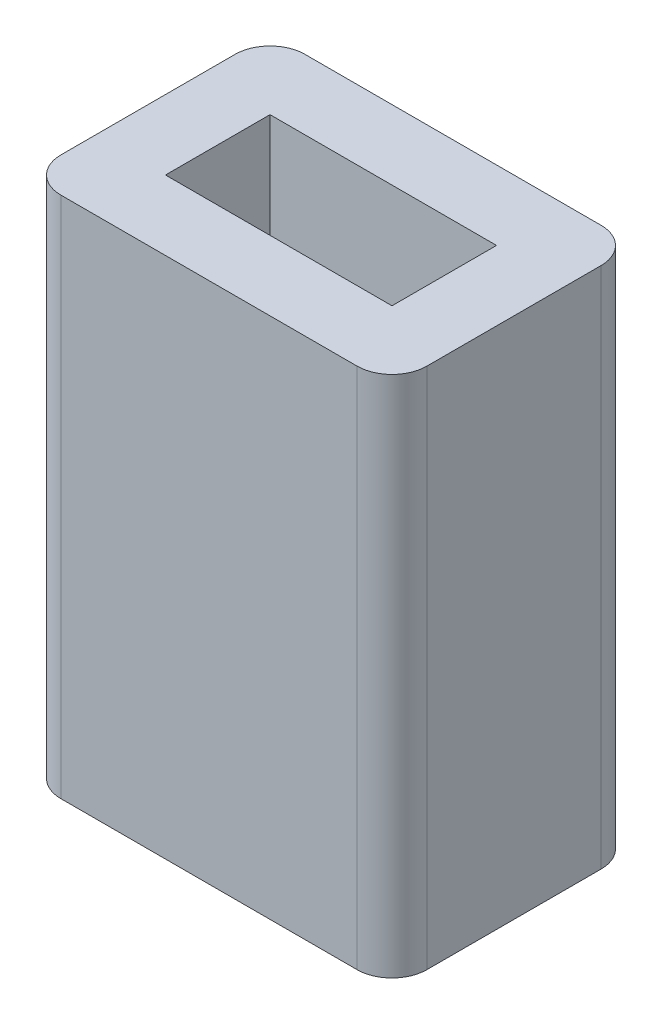
ISO-10303-21;
HEADER;
FILE_DESCRIPTION(('STEP AP214'),'2;1');
FILE_NAME('part.step','',(''),(''),'','','');
FILE_SCHEMA(('AUTOMOTIVE_DESIGN { 1 0 10303 214 1 1 1 1 }'));
ENDSEC;
DATA;
#1=APPLICATION_CONTEXT('core data for automotive mechanical design processes');
#2=APPLICATION_PROTOCOL_DEFINITION('international standard','automotive_design',2000,#1);
#3=PRODUCT_CONTEXT('',#1,'mechanical');
#4=PRODUCT('Part','Part','',(#3));
#5=PRODUCT_RELATED_PRODUCT_CATEGORY('part','',(#4));
#6=PRODUCT_DEFINITION_FORMATION('','',#4);
#7=PRODUCT_DEFINITION_CONTEXT('part definition',#1,'design');
#8=PRODUCT_DEFINITION('design','',#6,#7);
#9=PRODUCT_DEFINITION_SHAPE('','',#8);
#10=(LENGTH_UNIT() NAMED_UNIT(*) SI_UNIT(.MILLI.,.METRE.));
#11=(NAMED_UNIT(*) PLANE_ANGLE_UNIT() SI_UNIT($,.RADIAN.));
#12=(NAMED_UNIT(*) SI_UNIT($,.STERADIAN.) SOLID_ANGLE_UNIT());
#13=UNCERTAINTY_MEASURE_WITH_UNIT(LENGTH_MEASURE(1.E-05),#10,'distance_accuracy_value','');
#14=(GEOMETRIC_REPRESENTATION_CONTEXT(3) GLOBAL_UNCERTAINTY_ASSIGNED_CONTEXT((#13)) GLOBAL_UNIT_ASSIGNED_CONTEXT((#10,
#11,#12)) REPRESENTATION_CONTEXT('',''));
#15=CARTESIAN_POINT('',(0.,0.,0.));
#16=DIRECTION('',(0.,0.,1.));
#17=DIRECTION('',(1.,0.,0.));
#18=AXIS2_PLACEMENT_3D('',#15,#16,#17);
#19=CARTESIAN_POINT('',(0.,15.,0.));
#20=DIRECTION('',(0.,1.,0.));
#21=DIRECTION('',(0.,0.,1.));
#22=AXIS2_PLACEMENT_3D('',#19,#20,#21);
#23=PLANE('',#22);
#24=DIRECTION('',(-1.,0.,0.));
#25=VECTOR('',#24,1.);
#26=CARTESIAN_POINT('',(-5.25,15.,-3.5));
#27=LINE('',#26,#25);
#28=CARTESIAN_POINT('',(4.25,15.,-3.5));
#29=VERTEX_POINT('',#28);
#30=CARTESIAN_POINT('',(-4.25,15.,-3.5));
#31=VERTEX_POINT('',#30);
#32=EDGE_CURVE('E195',#29,#31,#27,.T.);
#33=ORIENTED_EDGE('',*,*,#32,.T.);
#34=CARTESIAN_POINT('',(-4.25,15.,-2.5));
#35=DIRECTION('',(0.,1.,0.));
#36=DIRECTION('',(0.,0.,1.));
#37=AXIS2_PLACEMENT_3D('',#34,#35,#36);
#38=CIRCLE('',#37,1.);
#39=CARTESIAN_POINT('',(-5.25,15.,-2.5));
#40=VERTEX_POINT('',#39);
#41=EDGE_CURVE('E250',#31,#40,#38,.T.);
#42=ORIENTED_EDGE('',*,*,#41,.T.);
#43=DIRECTION('',(0.,0.,1.));
#44=VECTOR('',#43,1.);
#45=CARTESIAN_POINT('',(-5.25,15.,3.5));
#46=LINE('',#45,#44);
#47=CARTESIAN_POINT('',(-5.25,15.,2.5));
#48=VERTEX_POINT('',#47);
#49=EDGE_CURVE('E199',#40,#48,#46,.T.);
#50=ORIENTED_EDGE('',*,*,#49,.T.);
#51=CARTESIAN_POINT('',(-4.25,15.,2.5));
#52=DIRECTION('',(0.,1.,0.));
#53=DIRECTION('',(0.,0.,1.));
#54=AXIS2_PLACEMENT_3D('',#51,#52,#53);
#55=CIRCLE('',#54,1.);
#56=CARTESIAN_POINT('',(-4.25,15.,3.5));
#57=VERTEX_POINT('',#56);
#58=EDGE_CURVE('E242',#48,#57,#55,.T.);
#59=ORIENTED_EDGE('',*,*,#58,.T.);
#60=DIRECTION('',(1.,0.,0.));
#61=VECTOR('',#60,1.);
#62=CARTESIAN_POINT('',(-5.25,15.,3.5));
#63=LINE('',#62,#61);
#64=CARTESIAN_POINT('',(4.25,15.,3.5));
#65=VERTEX_POINT('',#64);
#66=EDGE_CURVE('E188',#57,#65,#63,.T.);
#67=ORIENTED_EDGE('',*,*,#66,.T.);
#68=CARTESIAN_POINT('',(4.25,15.,2.5));
#69=DIRECTION('',(0.,1.,0.));
#70=DIRECTION('',(0.,0.,1.));
#71=AXIS2_PLACEMENT_3D('',#68,#69,#70);
#72=CIRCLE('',#71,1.);
#73=CARTESIAN_POINT('',(5.25,15.,2.5));
#74=VERTEX_POINT('',#73);
#75=EDGE_CURVE('E66',#65,#74,#72,.T.);
#76=ORIENTED_EDGE('',*,*,#75,.T.);
#77=DIRECTION('',(0.,0.,-1.));
#78=VECTOR('',#77,1.);
#79=CARTESIAN_POINT('',(5.25,15.,3.5));
#80=LINE('',#79,#78);
#81=CARTESIAN_POINT('',(5.25,15.,-2.5));
#82=VERTEX_POINT('',#81);
#83=EDGE_CURVE('E191',#74,#82,#80,.T.);
#84=ORIENTED_EDGE('',*,*,#83,.T.);
#85=CARTESIAN_POINT('',(4.25,15.,-2.5));
#86=DIRECTION('',(0.,1.,0.));
#87=DIRECTION('',(0.,0.,1.));
#88=AXIS2_PLACEMENT_3D('',#85,#86,#87);
#89=CIRCLE('',#88,1.);
#90=EDGE_CURVE('E247',#82,#29,#89,.T.);
#91=ORIENTED_EDGE('',*,*,#90,.T.);
#92=EDGE_LOOP('',(#33,#42,#50,#59,#67,#76,#84,#91));
#93=FACE_BOUND('',#92,.T.);
#94=DIRECTION('',(-1.,0.,0.));
#95=VECTOR('',#94,1.);
#96=CARTESIAN_POINT('',(-3.25,15.,-1.5));
#97=LINE('',#96,#95);
#98=CARTESIAN_POINT('',(3.25,15.,-1.5));
#99=VERTEX_POINT('',#98);
#100=CARTESIAN_POINT('',(-3.25,15.,-1.5));
#101=VERTEX_POINT('',#100);
#102=EDGE_CURVE('E146',#99,#101,#97,.T.);
#103=ORIENTED_EDGE('',*,*,#102,.F.);
#104=DIRECTION('',(0.,0.,-1.));
#105=VECTOR('',#104,1.);
#106=CARTESIAN_POINT('',(3.25,15.,1.5));
#107=LINE('',#106,#105);
#108=CARTESIAN_POINT('',(3.25,15.,1.5));
#109=VERTEX_POINT('',#108);
#110=EDGE_CURVE('E135',#109,#99,#107,.T.);
#111=ORIENTED_EDGE('',*,*,#110,.F.);
#112=DIRECTION('',(1.,0.,0.));
#113=VECTOR('',#112,1.);
#114=CARTESIAN_POINT('',(-3.25,15.,1.5));
#115=LINE('',#114,#113);
#116=CARTESIAN_POINT('',(-3.25,15.,1.5));
#117=VERTEX_POINT('',#116);
#118=EDGE_CURVE('E164',#117,#109,#115,.T.);
#119=ORIENTED_EDGE('',*,*,#118,.F.);
#120=DIRECTION('',(0.,0.,1.));
#121=VECTOR('',#120,1.);
#122=CARTESIAN_POINT('',(-3.25,15.,1.5));
#123=LINE('',#122,#121);
#124=EDGE_CURVE('E160',#101,#117,#123,.T.);
#125=ORIENTED_EDGE('',*,*,#124,.F.);
#126=EDGE_LOOP('',(#103,#111,#119,#125));
#127=FACE_BOUND('',#126,.T.);
#128=ADVANCED_FACE('F43',(#93,#127),#23,.T.);
#129=CARTESIAN_POINT('',(0.,0.,0.));
#130=DIRECTION('',(0.,1.,0.));
#131=DIRECTION('',(0.,0.,1.));
#132=AXIS2_PLACEMENT_3D('',#129,#130,#131);
#133=PLANE('',#132);
#134=DIRECTION('',(0.,0.,1.));
#135=VECTOR('',#134,1.);
#136=CARTESIAN_POINT('',(-5.25,0.,3.5));
#137=LINE('',#136,#135);
#138=CARTESIAN_POINT('',(-5.25,0.,-2.5));
#139=VERTEX_POINT('',#138);
#140=CARTESIAN_POINT('',(-5.25,0.,2.5));
#141=VERTEX_POINT('',#140);
#142=EDGE_CURVE('E192',#139,#141,#137,.T.);
#143=ORIENTED_EDGE('',*,*,#142,.F.);
#144=CARTESIAN_POINT('',(-4.25,0.,-2.5));
#145=DIRECTION('',(0.,1.,0.));
#146=DIRECTION('',(0.,0.,1.));
#147=AXIS2_PLACEMENT_3D('',#144,#145,#146);
#148=CIRCLE('',#147,1.);
#149=CARTESIAN_POINT('',(-4.25,0.,-3.5));
#150=VERTEX_POINT('',#149);
#151=EDGE_CURVE('E232',#139,#150,#148,.F.);
#152=ORIENTED_EDGE('',*,*,#151,.T.);
#153=DIRECTION('',(-1.,0.,0.));
#154=VECTOR('',#153,1.);
#155=CARTESIAN_POINT('',(-5.25,0.,-3.5));
#156=LINE('',#155,#154);
#157=CARTESIAN_POINT('',(4.25,0.,-3.5));
#158=VERTEX_POINT('',#157);
#159=EDGE_CURVE('E210',#158,#150,#156,.T.);
#160=ORIENTED_EDGE('',*,*,#159,.F.);
#161=CARTESIAN_POINT('',(4.25,0.,-2.5));
#162=DIRECTION('',(0.,1.,0.));
#163=DIRECTION('',(0.,0.,1.));
#164=AXIS2_PLACEMENT_3D('',#161,#162,#163);
#165=CIRCLE('',#164,1.);
#166=CARTESIAN_POINT('',(5.25,0.,-2.5));
#167=VERTEX_POINT('',#166);
#168=EDGE_CURVE('E229',#158,#167,#165,.F.);
#169=ORIENTED_EDGE('',*,*,#168,.T.);
#170=DIRECTION('',(0.,0.,-1.));
#171=VECTOR('',#170,1.);
#172=CARTESIAN_POINT('',(5.25,0.,3.5));
#173=LINE('',#172,#171);
#174=CARTESIAN_POINT('',(5.25,0.,2.5));
#175=VERTEX_POINT('',#174);
#176=EDGE_CURVE('E207',#175,#167,#173,.T.);
#177=ORIENTED_EDGE('',*,*,#176,.F.);
#178=CARTESIAN_POINT('',(4.25,0.,2.5));
#179=DIRECTION('',(0.,1.,0.));
#180=DIRECTION('',(0.,0.,1.));
#181=AXIS2_PLACEMENT_3D('',#178,#179,#180);
#182=CIRCLE('',#181,1.);
#183=CARTESIAN_POINT('',(4.25,0.,3.5));
#184=VERTEX_POINT('',#183);
#185=EDGE_CURVE('E226',#175,#184,#182,.F.);
#186=ORIENTED_EDGE('',*,*,#185,.T.);
#187=DIRECTION('',(1.,0.,0.));
#188=VECTOR('',#187,1.);
#189=CARTESIAN_POINT('',(-5.25,0.,3.5));
#190=LINE('',#189,#188);
#191=CARTESIAN_POINT('',(-4.25,0.,3.5));
#192=VERTEX_POINT('',#191);
#193=EDGE_CURVE('E155',#192,#184,#190,.T.);
#194=ORIENTED_EDGE('',*,*,#193,.F.);
#195=CARTESIAN_POINT('',(-4.25,0.,2.5));
#196=DIRECTION('',(0.,1.,0.));
#197=DIRECTION('',(0.,0.,1.));
#198=AXIS2_PLACEMENT_3D('',#195,#196,#197);
#199=CIRCLE('',#198,1.);
#200=EDGE_CURVE('E223',#192,#141,#199,.F.);
#201=ORIENTED_EDGE('',*,*,#200,.T.);
#202=EDGE_LOOP('',(#143,#152,#160,#169,#177,#186,#194,#201));
#203=FACE_BOUND('',#202,.T.);
#204=DIRECTION('',(0.,0.,-1.));
#205=VECTOR('',#204,1.);
#206=CARTESIAN_POINT('',(3.25,0.,1.5));
#207=LINE('',#206,#205);
#208=CARTESIAN_POINT('',(3.25,0.,1.5));
#209=VERTEX_POINT('',#208);
#210=CARTESIAN_POINT('',(3.25,0.,-1.5));
#211=VERTEX_POINT('',#210);
#212=EDGE_CURVE('E169',#209,#211,#207,.T.);
#213=ORIENTED_EDGE('',*,*,#212,.T.);
#214=DIRECTION('',(-1.,0.,0.));
#215=VECTOR('',#214,1.);
#216=CARTESIAN_POINT('',(-3.25,0.,-1.5));
#217=LINE('',#216,#215);
#218=CARTESIAN_POINT('',(-3.25,0.,-1.5));
#219=VERTEX_POINT('',#218);
#220=EDGE_CURVE('E153',#211,#219,#217,.T.);
#221=ORIENTED_EDGE('',*,*,#220,.T.);
#222=DIRECTION('',(0.,0.,1.));
#223=VECTOR('',#222,1.);
#224=CARTESIAN_POINT('',(-3.25,0.,1.5));
#225=LINE('',#224,#223);
#226=CARTESIAN_POINT('',(-3.25,0.,1.5));
#227=VERTEX_POINT('',#226);
#228=EDGE_CURVE('E174',#219,#227,#225,.T.);
#229=ORIENTED_EDGE('',*,*,#228,.T.);
#230=DIRECTION('',(1.,0.,0.));
#231=VECTOR('',#230,1.);
#232=CARTESIAN_POINT('',(-3.25,0.,1.5));
#233=LINE('',#232,#231);
#234=EDGE_CURVE('E147',#227,#209,#233,.T.);
#235=ORIENTED_EDGE('',*,*,#234,.T.);
#236=EDGE_LOOP('',(#213,#221,#229,#235));
#237=FACE_BOUND('',#236,.T.);
#238=ADVANCED_FACE('F270',(#203,#237),#133,.F.);
#239=CARTESIAN_POINT('',(-5.25,15.,3.5));
#240=DIRECTION('',(0.,0.,-1.));
#241=DIRECTION('',(-1.,0.,0.));
#242=AXIS2_PLACEMENT_3D('',#239,#240,#241);
#243=PLANE('',#242);
#244=ORIENTED_EDGE('',*,*,#193,.T.);
#245=DIRECTION('',(0.,-1.,0.));
#246=VECTOR('',#245,1.);
#247=CARTESIAN_POINT('',(4.25,15.,3.5));
#248=LINE('',#247,#246);
#249=EDGE_CURVE('E11',#184,#65,#248,.F.);
#250=ORIENTED_EDGE('',*,*,#249,.T.);
#251=ORIENTED_EDGE('',*,*,#66,.F.);
#252=DIRECTION('',(0.,-1.,0.));
#253=VECTOR('',#252,1.);
#254=CARTESIAN_POINT('',(-4.25,15.,3.5));
#255=LINE('',#254,#253);
#256=EDGE_CURVE('E52',#57,#192,#255,.T.);
#257=ORIENTED_EDGE('',*,*,#256,.T.);
#258=EDGE_LOOP('',(#244,#250,#251,#257));
#259=FACE_BOUND('',#258,.T.);
#260=ADVANCED_FACE('F264',(#259),#243,.F.);
#261=CARTESIAN_POINT('',(5.25,15.,3.5));
#262=DIRECTION('',(-1.,0.,0.));
#263=DIRECTION('',(0.,0.,1.));
#264=AXIS2_PLACEMENT_3D('',#261,#262,#263);
#265=PLANE('',#264);
#266=ORIENTED_EDGE('',*,*,#176,.T.);
#267=DIRECTION('',(0.,-1.,0.));
#268=VECTOR('',#267,1.);
#269=CARTESIAN_POINT('',(5.25,15.,-2.5));
#270=LINE('',#269,#268);
#271=EDGE_CURVE('E59',#167,#82,#270,.F.);
#272=ORIENTED_EDGE('',*,*,#271,.T.);
#273=ORIENTED_EDGE('',*,*,#83,.F.);
#274=DIRECTION('',(0.,-1.,0.));
#275=VECTOR('',#274,1.);
#276=CARTESIAN_POINT('',(5.25,15.,2.5));
#277=LINE('',#276,#275);
#278=EDGE_CURVE('E253',#74,#175,#277,.T.);
#279=ORIENTED_EDGE('',*,*,#278,.T.);
#280=EDGE_LOOP('',(#266,#272,#273,#279));
#281=FACE_BOUND('',#280,.T.);
#282=ADVANCED_FACE('F276',(#281),#265,.F.);
#283=CARTESIAN_POINT('',(-5.25,15.,-3.5));
#284=DIRECTION('',(0.,0.,1.));
#285=DIRECTION('',(1.,0.,0.));
#286=AXIS2_PLACEMENT_3D('',#283,#284,#285);
#287=PLANE('',#286);
#288=ORIENTED_EDGE('',*,*,#159,.T.);
#289=DIRECTION('',(0.,-1.,0.));
#290=VECTOR('',#289,1.);
#291=CARTESIAN_POINT('',(-4.25,15.,-3.5));
#292=LINE('',#291,#290);
#293=EDGE_CURVE('E239',#150,#31,#292,.F.);
#294=ORIENTED_EDGE('',*,*,#293,.T.);
#295=ORIENTED_EDGE('',*,*,#32,.F.);
#296=DIRECTION('',(0.,-1.,0.));
#297=VECTOR('',#296,1.);
#298=CARTESIAN_POINT('',(4.25,15.,-3.5));
#299=LINE('',#298,#297);
#300=EDGE_CURVE('E235',#29,#158,#299,.T.);
#301=ORIENTED_EDGE('',*,*,#300,.T.);
#302=EDGE_LOOP('',(#288,#294,#295,#301));
#303=FACE_BOUND('',#302,.T.);
#304=ADVANCED_FACE('F284',(#303),#287,.F.);
#305=CARTESIAN_POINT('',(-5.25,15.,3.5));
#306=DIRECTION('',(1.,0.,0.));
#307=DIRECTION('',(0.,0.,-1.));
#308=AXIS2_PLACEMENT_3D('',#305,#306,#307);
#309=PLANE('',#308);
#310=ORIENTED_EDGE('',*,*,#49,.F.);
#311=DIRECTION('',(0.,-1.,0.));
#312=VECTOR('',#311,1.);
#313=CARTESIAN_POINT('',(-5.25,15.,-2.5));
#314=LINE('',#313,#312);
#315=EDGE_CURVE('E219',#40,#139,#314,.T.);
#316=ORIENTED_EDGE('',*,*,#315,.T.);
#317=ORIENTED_EDGE('',*,*,#142,.T.);
#318=DIRECTION('',(0.,-1.,0.));
#319=VECTOR('',#318,1.);
#320=CARTESIAN_POINT('',(-5.25,15.,2.5));
#321=LINE('',#320,#319);
#322=EDGE_CURVE('E203',#141,#48,#321,.F.);
#323=ORIENTED_EDGE('',*,*,#322,.T.);
#324=EDGE_LOOP('',(#310,#316,#317,#323));
#325=FACE_BOUND('',#324,.T.);
#326=ADVANCED_FACE('F292',(#325),#309,.F.);
#327=CARTESIAN_POINT('',(3.25,15.,1.5));
#328=DIRECTION('',(-1.,0.,0.));
#329=DIRECTION('',(0.,0.,1.));
#330=AXIS2_PLACEMENT_3D('',#327,#328,#329);
#331=PLANE('',#330);
#332=ORIENTED_EDGE('',*,*,#212,.F.);
#333=DIRECTION('',(0.,-1.,0.));
#334=VECTOR('',#333,1.);
#335=CARTESIAN_POINT('',(3.25,15.,1.5));
#336=LINE('',#335,#334);
#337=EDGE_CURVE('E141',#109,#209,#336,.T.);
#338=ORIENTED_EDGE('',*,*,#337,.F.);
#339=ORIENTED_EDGE('',*,*,#110,.T.);
#340=DIRECTION('',(0.,-1.,0.));
#341=VECTOR('',#340,1.);
#342=CARTESIAN_POINT('',(3.25,15.,-1.5));
#343=LINE('',#342,#341);
#344=EDGE_CURVE('E138',#99,#211,#343,.T.);
#345=ORIENTED_EDGE('',*,*,#344,.T.);
#346=EDGE_LOOP('',(#332,#338,#339,#345));
#347=FACE_BOUND('',#346,.T.);
#348=ADVANCED_FACE('F137',(#347),#331,.T.);
#349=CARTESIAN_POINT('',(-3.25,15.,-1.5));
#350=DIRECTION('',(0.,0.,1.));
#351=DIRECTION('',(1.,0.,0.));
#352=AXIS2_PLACEMENT_3D('',#349,#350,#351);
#353=PLANE('',#352);
#354=ORIENTED_EDGE('',*,*,#220,.F.);
#355=ORIENTED_EDGE('',*,*,#344,.F.);
#356=ORIENTED_EDGE('',*,*,#102,.T.);
#357=DIRECTION('',(0.,-1.,0.));
#358=VECTOR('',#357,1.);
#359=CARTESIAN_POINT('',(-3.25,15.,-1.5));
#360=LINE('',#359,#358);
#361=EDGE_CURVE('E156',#101,#219,#360,.T.);
#362=ORIENTED_EDGE('',*,*,#361,.T.);
#363=EDGE_LOOP('',(#354,#355,#356,#362));
#364=FACE_BOUND('',#363,.T.);
#365=ADVANCED_FACE('F150',(#364),#353,.T.);
#366=CARTESIAN_POINT('',(-3.25,15.,1.5));
#367=DIRECTION('',(1.,0.,0.));
#368=DIRECTION('',(0.,0.,-1.));
#369=AXIS2_PLACEMENT_3D('',#366,#367,#368);
#370=PLANE('',#369);
#371=ORIENTED_EDGE('',*,*,#228,.F.);
#372=ORIENTED_EDGE('',*,*,#361,.F.);
#373=ORIENTED_EDGE('',*,*,#124,.T.);
#374=DIRECTION('',(0.,-1.,0.));
#375=VECTOR('',#374,1.);
#376=CARTESIAN_POINT('',(-3.25,15.,1.5));
#377=LINE('',#376,#375);
#378=EDGE_CURVE('E183',#117,#227,#377,.T.);
#379=ORIENTED_EDGE('',*,*,#378,.T.);
#380=EDGE_LOOP('',(#371,#372,#373,#379));
#381=FACE_BOUND('',#380,.T.);
#382=ADVANCED_FACE('F353',(#381),#370,.T.);
#383=CARTESIAN_POINT('',(-3.25,15.,1.5));
#384=DIRECTION('',(0.,0.,-1.));
#385=DIRECTION('',(-1.,0.,0.));
#386=AXIS2_PLACEMENT_3D('',#383,#384,#385);
#387=PLANE('',#386);
#388=ORIENTED_EDGE('',*,*,#234,.F.);
#389=ORIENTED_EDGE('',*,*,#378,.F.);
#390=ORIENTED_EDGE('',*,*,#118,.T.);
#391=ORIENTED_EDGE('',*,*,#337,.T.);
#392=EDGE_LOOP('',(#388,#389,#390,#391));
#393=FACE_BOUND('',#392,.T.);
#394=ADVANCED_FACE('F317',(#393),#387,.T.);
#395=CARTESIAN_POINT('',(-4.25,15.,-2.5));
#396=DIRECTION('',(0.,-1.,0.));
#397=DIRECTION('',(0.,0.,-1.));
#398=AXIS2_PLACEMENT_3D('',#395,#396,#397);
#399=CYLINDRICAL_SURFACE('',#398,1.);
#400=ORIENTED_EDGE('',*,*,#41,.F.);
#401=ORIENTED_EDGE('',*,*,#293,.F.);
#402=ORIENTED_EDGE('',*,*,#151,.F.);
#403=ORIENTED_EDGE('',*,*,#315,.F.);
#404=EDGE_LOOP('',(#400,#401,#402,#403));
#405=FACE_BOUND('',#404,.T.);
#406=ADVANCED_FACE('F289',(#405),#399,.T.);
#407=CARTESIAN_POINT('',(4.25,15.,-2.5));
#408=DIRECTION('',(0.,-1.,0.));
#409=DIRECTION('',(0.,0.,-1.));
#410=AXIS2_PLACEMENT_3D('',#407,#408,#409);
#411=CYLINDRICAL_SURFACE('',#410,1.);
#412=ORIENTED_EDGE('',*,*,#90,.F.);
#413=ORIENTED_EDGE('',*,*,#271,.F.);
#414=ORIENTED_EDGE('',*,*,#168,.F.);
#415=ORIENTED_EDGE('',*,*,#300,.F.);
#416=EDGE_LOOP('',(#412,#413,#414,#415));
#417=FACE_BOUND('',#416,.T.);
#418=ADVANCED_FACE('F281',(#417),#411,.T.);
#419=CARTESIAN_POINT('',(4.25,15.,2.5));
#420=DIRECTION('',(0.,-1.,0.));
#421=DIRECTION('',(0.,0.,-1.));
#422=AXIS2_PLACEMENT_3D('',#419,#420,#421);
#423=CYLINDRICAL_SURFACE('',#422,1.);
#424=ORIENTED_EDGE('',*,*,#75,.F.);
#425=ORIENTED_EDGE('',*,*,#249,.F.);
#426=ORIENTED_EDGE('',*,*,#185,.F.);
#427=ORIENTED_EDGE('',*,*,#278,.F.);
#428=EDGE_LOOP('',(#424,#425,#426,#427));
#429=FACE_BOUND('',#428,.T.);
#430=ADVANCED_FACE('F275',(#429),#423,.T.);
#431=CARTESIAN_POINT('',(-4.25,15.,2.5));
#432=DIRECTION('',(0.,-1.,0.));
#433=DIRECTION('',(0.,0.,-1.));
#434=AXIS2_PLACEMENT_3D('',#431,#432,#433);
#435=CYLINDRICAL_SURFACE('',#434,1.);
#436=ORIENTED_EDGE('',*,*,#58,.F.);
#437=ORIENTED_EDGE('',*,*,#322,.F.);
#438=ORIENTED_EDGE('',*,*,#200,.F.);
#439=ORIENTED_EDGE('',*,*,#256,.F.);
#440=EDGE_LOOP('',(#436,#437,#438,#439));
#441=FACE_BOUND('',#440,.T.);
#442=ADVANCED_FACE('F45',(#441),#435,.T.);
#443=CLOSED_SHELL('',(#128,#238,#260,#282,#304,#326,#348,#365,#382,#394,#406,#418,#430,#442));
#444=MANIFOLD_SOLID_BREP('B2',#443);
#445=ADVANCED_BREP_SHAPE_REPRESENTATION('',(#18,#444),#14);
#446=SHAPE_DEFINITION_REPRESENTATION(#9,#445);
ENDSEC;
END-ISO-10303-21;
